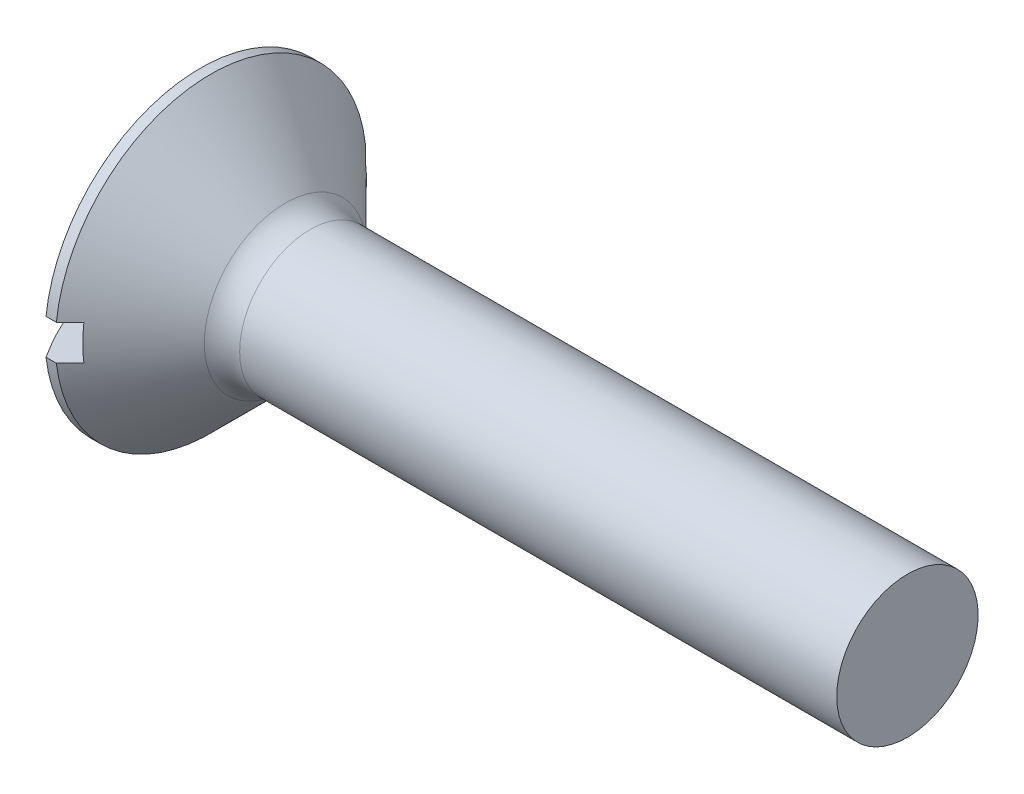
ISO-10303-21;
HEADER;
FILE_DESCRIPTION(('STEP AP214'),'2;1');
FILE_NAME('part.step','',(''),(''),'','','');
FILE_SCHEMA(('AUTOMOTIVE_DESIGN { 1 0 10303 214 1 1 1 1 }'));
ENDSEC;
DATA;
#1=APPLICATION_CONTEXT('core data for automotive mechanical design processes');
#2=APPLICATION_PROTOCOL_DEFINITION('international standard','automotive_design',2000,#1);
#3=PRODUCT_CONTEXT('',#1,'mechanical');
#4=PRODUCT('Part','Part','',(#3));
#5=PRODUCT_RELATED_PRODUCT_CATEGORY('part','',(#4));
#6=PRODUCT_DEFINITION_FORMATION('','',#4);
#7=PRODUCT_DEFINITION_CONTEXT('part definition',#1,'design');
#8=PRODUCT_DEFINITION('design','',#6,#7);
#9=PRODUCT_DEFINITION_SHAPE('','',#8);
#10=(LENGTH_UNIT() NAMED_UNIT(*) SI_UNIT(.MILLI.,.METRE.));
#11=(NAMED_UNIT(*) PLANE_ANGLE_UNIT() SI_UNIT($,.RADIAN.));
#12=(NAMED_UNIT(*) SI_UNIT($,.STERADIAN.) SOLID_ANGLE_UNIT());
#13=UNCERTAINTY_MEASURE_WITH_UNIT(LENGTH_MEASURE(1.E-05),#10,'distance_accuracy_value','');
#14=(GEOMETRIC_REPRESENTATION_CONTEXT(3) GLOBAL_UNCERTAINTY_ASSIGNED_CONTEXT((#13)) GLOBAL_UNIT_ASSIGNED_CONTEXT((#10,
#11,#12)) REPRESENTATION_CONTEXT('',''));
#15=CARTESIAN_POINT('',(0.,0.,0.));
#16=DIRECTION('',(0.,0.,1.));
#17=DIRECTION('',(1.,0.,0.));
#18=AXIS2_PLACEMENT_3D('',#15,#16,#17);
#19=CARTESIAN_POINT('',(-1.34990698556869,0.,0.));
#20=DIRECTION('',(-1.,0.,0.));
#21=DIRECTION('',(0.,0.,1.));
#22=AXIS2_PLACEMENT_3D('',#19,#20,#21);
#23=CYLINDRICAL_SURFACE('',#22,2.2);
#24=CARTESIAN_POINT('',(0.805787991708701,0.,0.));
#25=DIRECTION('',(-1.,0.,0.));
#26=DIRECTION('',(0.,0.,1.));
#27=AXIS2_PLACEMENT_3D('',#24,#25,#26);
#28=CIRCLE('',#27,2.2);
#29=CARTESIAN_POINT('',(0.805787991708701,-0.25,-2.18574929943944));
#30=VERTEX_POINT('',#29);
#31=CARTESIAN_POINT('',(0.805787991708701,-0.25,2.18574929943944));
#32=VERTEX_POINT('',#31);
#33=EDGE_CURVE('E107',#30,#32,#28,.T.);
#34=ORIENTED_EDGE('',*,*,#33,.T.);
#35=DIRECTION('',(-1.,0.,0.));
#36=VECTOR('',#35,1.);
#37=CARTESIAN_POINT('',(-1.34990698556869,-0.25,2.18574929943944));
#38=LINE('',#37,#36);
#39=CARTESIAN_POINT('',(0.659341382301987,-0.25,2.18574929943944));
#40=VERTEX_POINT('',#39);
#41=EDGE_CURVE('E112',#32,#40,#38,.T.);
#42=ORIENTED_EDGE('',*,*,#41,.T.);
#43=CARTESIAN_POINT('',(0.659341382301987,0.,0.));
#44=DIRECTION('',(-1.,0.,0.));
#45=DIRECTION('',(0.,0.,1.));
#46=AXIS2_PLACEMENT_3D('',#43,#44,#45);
#47=CIRCLE('',#46,2.2);
#48=CARTESIAN_POINT('',(0.659341382301987,-0.25,-2.18574929943944));
#49=VERTEX_POINT('',#48);
#50=EDGE_CURVE('E157',#49,#40,#47,.T.);
#51=ORIENTED_EDGE('',*,*,#50,.F.);
#52=DIRECTION('',(-1.,0.,0.));
#53=VECTOR('',#52,1.);
#54=CARTESIAN_POINT('',(-1.34990698556869,-0.25,-2.18574929943944));
#55=LINE('',#54,#53);
#56=EDGE_CURVE('E52',#49,#30,#55,.F.);
#57=ORIENTED_EDGE('',*,*,#56,.T.);
#58=EDGE_LOOP('',(#34,#42,#51,#57));
#59=FACE_BOUND('',#58,.T.);
#60=ADVANCED_FACE('F37',(#59),#23,.T.);
#61=CARTESIAN_POINT('',(4.,0.,0.));
#62=DIRECTION('',(-1.,0.,0.));
#63=DIRECTION('',(0.,1.,0.));
#64=AXIS2_PLACEMENT_3D('',#61,#62,#63);
#65=SPHERICAL_SURFACE('',#64,4.);
#66=CARTESIAN_POINT('',(0.659341382301987,0.25,2.18574929943944));
#67=VERTEX_POINT('',#66);
#68=CARTESIAN_POINT('',(0.659341382301987,0.25,-2.18574929943944));
#69=VERTEX_POINT('',#68);
#70=EDGE_CURVE('E153',#67,#69,#47,.T.);
#71=ORIENTED_EDGE('',*,*,#70,.T.);
#72=CARTESIAN_POINT('',(4.,0.25,0.));
#73=DIRECTION('',(0.,1.,0.));
#74=DIRECTION('',(0.,0.,1.));
#75=AXIS2_PLACEMENT_3D('',#72,#73,#74);
#76=CIRCLE('',#75,3.99217985566783);
#77=EDGE_CURVE('E170',#69,#67,#76,.T.);
#78=ORIENTED_EDGE('',*,*,#77,.T.);
#79=EDGE_LOOP('',(#71,#78));
#80=FACE_BOUND('',#79,.T.);
#81=ADVANCED_FACE('F135',(#80),#65,.T.);
#82=CARTESIAN_POINT('',(10.659341382302,1.,0.));
#83=DIRECTION('',(-1.,0.,0.));
#84=DIRECTION('',(0.,0.,1.));
#85=AXIS2_PLACEMENT_3D('',#82,#83,#84);
#86=PLANE('',#85);
#87=CARTESIAN_POINT('',(10.659341382302,0.,0.));
#88=DIRECTION('',(-1.,0.,0.));
#89=DIRECTION('',(0.,0.,1.));
#90=AXIS2_PLACEMENT_3D('',#87,#88,#89);
#91=CIRCLE('',#90,1.);
#92=CARTESIAN_POINT('',(10.659341382302,0.,1.));
#93=VERTEX_POINT('',#92);
#94=EDGE_CURVE('E166',#93,#93,#91,.T.);
#95=ORIENTED_EDGE('',*,*,#94,.F.);
#96=EDGE_LOOP('',(#95));
#97=FACE_BOUND('',#96,.T.);
#98=ADVANCED_FACE('F39',(#97),#86,.F.);
#99=CARTESIAN_POINT('',(-1.34990698556869,0.,0.));
#100=DIRECTION('',(-1.,0.,0.));
#101=DIRECTION('',(0.,0.,1.));
#102=AXIS2_PLACEMENT_3D('',#99,#100,#101);
#103=CYLINDRICAL_SURFACE('',#102,1.);
#104=CARTESIAN_POINT('',(2.21289477289526,0.,0.));
#105=DIRECTION('',(-1.,0.,0.));
#106=DIRECTION('',(0.,0.,1.));
#107=AXIS2_PLACEMENT_3D('',#104,#105,#106);
#108=CIRCLE('',#107,1.);
#109=CARTESIAN_POINT('',(2.21289477289526,0.,1.));
#110=VERTEX_POINT('',#109);
#111=EDGE_CURVE('E163',#110,#110,#108,.T.);
#112=ORIENTED_EDGE('',*,*,#111,.F.);
#113=EDGE_LOOP('',(#112));
#114=FACE_BOUND('',#113,.T.);
#115=ORIENTED_EDGE('',*,*,#94,.T.);
#116=EDGE_LOOP('',(#115));
#117=FACE_BOUND('',#116,.T.);
#118=ADVANCED_FACE('F224',(#114,#117),#103,.T.);
#119=CARTESIAN_POINT('',(2.21289477289526,0.,0.));
#120=DIRECTION('',(-1.,0.,0.));
#121=DIRECTION('',(0.,0.,1.));
#122=AXIS2_PLACEMENT_3D('',#119,#120,#121);
#123=TOROIDAL_SURFACE('',#122,1.5,0.5);
#124=CARTESIAN_POINT('',(1.85934138230199,0.,0.));
#125=DIRECTION('',(-1.,0.,0.));
#126=DIRECTION('',(0.,0.,1.));
#127=AXIS2_PLACEMENT_3D('',#124,#125,#126);
#128=CIRCLE('',#127,1.14644660940672);
#129=CARTESIAN_POINT('',(1.85934138230199,0.,1.14644660940672));
#130=VERTEX_POINT('',#129);
#131=EDGE_CURVE('E155',#130,#130,#128,.T.);
#132=ORIENTED_EDGE('',*,*,#131,.F.);
#133=EDGE_LOOP('',(#132));
#134=FACE_BOUND('',#133,.T.);
#135=ORIENTED_EDGE('',*,*,#111,.T.);
#136=EDGE_LOOP('',(#135));
#137=FACE_BOUND('',#136,.T.);
#138=ADVANCED_FACE('F141',(#134,#137),#123,.F.);
#139=CARTESIAN_POINT('',(1.85934138230199,0.,0.));
#140=DIRECTION('',(-1.,0.,0.));
#141=DIRECTION('',(0.,0.,1.));
#142=AXIS2_PLACEMENT_3D('',#139,#140,#141);
#143=CONICAL_SURFACE('',#142,1.14644660940672,0.785398163397443);
#144=CARTESIAN_POINT('',(1.,0.,0.));
#145=DIRECTION('',(1.,0.,0.));
#146=DIRECTION('',(0.,0.,-1.));
#147=AXIS2_PLACEMENT_3D('',#144,#145,#146);
#148=CIRCLE('',#147,2.0057879917087);
#149=CARTESIAN_POINT('',(1.,-0.25,-1.99014709699631));
#150=VERTEX_POINT('',#149);
#151=CARTESIAN_POINT('',(1.,0.25,-1.99014709699631));
#152=VERTEX_POINT('',#151);
#153=EDGE_CURVE('E11',#150,#152,#148,.T.);
#154=ORIENTED_EDGE('',*,*,#153,.T.);
#155=CARTESIAN_POINT('',(-1.83698245948068,0.25,4.83631322837063));
#156=CARTESIAN_POINT('',(-1.67200251748976,0.25,4.67111124858432));
#157=CARTESIAN_POINT('',(-1.50703219750879,0.25,4.50589965403619));
#158=CARTESIAN_POINT('',(-1.17712189701564,0.25,4.17544365149756));
#159=CARTESIAN_POINT('',(-1.01218191674531,0.25,4.01019924326562));
#160=CARTESIAN_POINT('',(-0.682317079626345,0.25,3.67963765967747));
#161=CARTESIAN_POINT('',(-0.517392230465198,0.25,3.51432047664977));
#162=CARTESIAN_POINT('',(-0.187610029747062,0.25,3.18362124471735));
#163=CARTESIAN_POINT('',(-0.0227526776956365,0.25,3.0182391963058));
#164=CARTESIAN_POINT('',(0.310957822555568,0.25,2.68324954374364));
#165=CARTESIAN_POINT('',(0.479808267998293,0.25,2.51363924738426));
#166=CARTESIAN_POINT('',(0.817318165064023,0.25,2.17422109230254));
#167=CARTESIAN_POINT('',(0.985977612399083,0.25,2.00441322931174));
#168=CARTESIAN_POINT('',(1.23864723005972,0.25,1.74940368052243));
#169=CARTESIAN_POINT('',(1.32281246189407,0.25,1.66435565390886));
#170=CARTESIAN_POINT('',(1.49097971054593,0.25,1.49409670473752));
#171=CARTESIAN_POINT('',(1.574981725932,0.25,1.40888578076399));
#172=CARTESIAN_POINT('',(1.74270521030829,0.25,1.23819529064809));
#173=CARTESIAN_POINT('',(1.82642669067598,0.25,1.15271573567967));
#174=CARTESIAN_POINT('',(1.99336991992402,0.25,0.981270398184751));
#175=CARTESIAN_POINT('',(2.07659167828557,0.25,0.895304624943732));
#176=CARTESIAN_POINT('',(2.18157923543974,0.25,0.785407488852699));
#177=CARTESIAN_POINT('',(2.20387594501931,0.25,0.761984264736825));
#178=CARTESIAN_POINT('',(2.24835297867986,0.25,0.715027330641845));
#179=CARTESIAN_POINT('',(2.27053330122487,0.25,0.691493619212345));
#180=CARTESIAN_POINT('',(2.33674522419903,0.25,0.620804999273036));
#181=CARTESIAN_POINT('',(2.38056068789035,0.25,0.573445008800913));
#182=CARTESIAN_POINT('',(2.45273508441549,0.25,0.493510859429766));
#183=CARTESIAN_POINT('',(2.48141411295268,0.25,0.461225956584607));
#184=CARTESIAN_POINT('',(2.53801077597681,0.25,0.395724382069651));
#185=CARTESIAN_POINT('',(2.56592437474304,0.25,0.362504153200525));
#186=CARTESIAN_POINT('',(2.60656438876708,0.25,0.311422651604376));
#187=CARTESIAN_POINT('',(2.61996632046315,0.25,0.294102157274269));
#188=CARTESIAN_POINT('',(2.6460562160832,0.25,0.258934859656766));
#189=CARTESIAN_POINT('',(2.65874444926368,0.25,0.241088258778923));
#190=CARTESIAN_POINT('',(2.68293598049307,0.25,0.204736875664094));
#191=CARTESIAN_POINT('',(2.69444527453682,0.25,0.186236141515002));
#192=CARTESIAN_POINT('',(2.71558726577708,0.25,0.148210433053987));
#193=CARTESIAN_POINT('',(2.7252251406011,0.25,0.128688479994859));
#194=CARTESIAN_POINT('',(2.7393019583475,0.25,0.0933128960668353));
#195=CARTESIAN_POINT('',(2.74443725670789,0.25,0.0777471951612877));
#196=CARTESIAN_POINT('',(2.75204947134678,0.25,0.046014532858441));
#197=CARTESIAN_POINT('',(2.75453865938164,0.25,0.029850709984747));
#198=CARTESIAN_POINT('',(2.75630624384426,0.25,-0.00280238691021115));
#199=CARTESIAN_POINT('',(2.75555754608878,0.25,-0.0192932533342108));
#200=CARTESIAN_POINT('',(2.75098042671744,0.25,-0.0518644022865893));
#201=CARTESIAN_POINT('',(2.74714133417458,0.25,-0.0679430626680099));
#202=CARTESIAN_POINT('',(2.73445798437951,0.25,-0.107972205138843));
#203=CARTESIAN_POINT('',(2.72402277208825,0.25,-0.131395389372218));
#204=CARTESIAN_POINT('',(2.70620549483301,0.25,-0.165353168235739));
#205=CARTESIAN_POINT('',(2.69988385651598,0.25,-0.176507300247304));
#206=CARTESIAN_POINT('',(2.68669482802784,0.25,-0.198488199382887));
#207=CARTESIAN_POINT('',(2.67982767628442,0.25,-0.209315106701697));
#208=CARTESIAN_POINT('',(2.65584214388967,0.25,-0.245635326298212));
#209=CARTESIAN_POINT('',(2.63779409007131,0.25,-0.270506382016466));
#210=CARTESIAN_POINT('',(2.60051835427222,0.25,-0.319355035634598));
#211=CARTESIAN_POINT('',(2.58128966891391,0.25,-0.343331844935442));
#212=CARTESIAN_POINT('',(2.54209197784562,0.25,-0.390758871578168));
#213=CARTESIAN_POINT('',(2.52212144369132,0.25,-0.414207821299323));
#214=CARTESIAN_POINT('',(2.4817349279707,0.25,-0.460720070548103));
#215=CARTESIAN_POINT('',(2.4613189026726,0.25,-0.483783331818401));
#216=CARTESIAN_POINT('',(2.39956443872557,0.25,-0.552654809945157));
#217=CARTESIAN_POINT('',(2.35778563744697,0.25,-0.598067191865122));
#218=CARTESIAN_POINT('',(2.27369736974625,0.25,-0.688267389393211));
#219=CARTESIAN_POINT('',(2.2313887779456,0.25,-0.733056028182925));
#220=CARTESIAN_POINT('',(2.10469544450037,0.25,-0.866154077145054));
#221=CARTESIAN_POINT('',(2.0198116428532,0.25,-0.95398788236113));
#222=CARTESIAN_POINT('',(1.84949069293147,0.25,-1.12911950364055));
#223=CARTESIAN_POINT('',(1.76405352448915,0.25,-1.21641729994028));
#224=CARTESIAN_POINT('',(1.59282418765089,0.25,-1.39076948189754));
#225=CARTESIAN_POINT('',(1.50703183385865,0.25,-1.47782368570018));
#226=CARTESIAN_POINT('',(1.33527318450732,0.25,-1.651757508343));
#227=CARTESIAN_POINT('',(1.24930689150799,0.25,-1.73863712971545));
#228=CARTESIAN_POINT('',(0.9917386319949,0.25,-1.99861440720129));
#229=CARTESIAN_POINT('',(0.819973992956283,0.25,-2.17155089213982));
#230=CARTESIAN_POINT('',(0.476274930135871,0.25,-2.51719193459411));
#231=CARTESIAN_POINT('',(0.304340543144986,0.25,-2.68989652873796));
#232=CARTESIAN_POINT('',(-0.0314189260324304,0.25,-3.02693427074177));
#233=CARTESIAN_POINT('',(-0.195238610301845,0.25,-3.19127279532241));
#234=CARTESIAN_POINT('',(-0.522952955185012,0.25,-3.51989485734883));
#235=CARTESIAN_POINT('',(-0.686847619730625,0.25,-3.6841783908726));
#236=CARTESIAN_POINT('',(-1.01510328717888,0.25,-4.01312614334428));
#237=CARTESIAN_POINT('',(-1.1794644020159,0.25,-4.17779025059113));
#238=CARTESIAN_POINT('',(-1.50820797637729,0.25,-4.50707716699987));
#239=CARTESIAN_POINT('',(-1.67259043399619,0.25,-4.67169997806405));
#240=CARTESIAN_POINT('',(-1.83698245948068,0.25,-4.83631322837063));
#241=B_SPLINE_CURVE_WITH_KNOTS('',3,(#155,#156,#157,#158,#159,#160,#161,#162,#163,#164,#165,
#166,#167,#168,#169,#170,#171,#172,#173,#174,#175,#176,#177,#178,#179,#180,#181,#182,#183,#184,
#185,#186,#187,#188,#189,#190,#191,#192,#193,#194,#195,#196,#197,#198,#199,#200,#201,#202,#203,
#204,#205,#206,#207,#208,#209,#210,#211,#212,#213,#214,#215,#216,#217,#218,#219,#220,#221,#222,
#223,#224,#225,#226,#227,#228,#229,#230,#231,#232,#233,#234,#235,#236,#237,#238,#239,#240),
.UNSPECIFIED.,.F.,.F.,(4,2,2,2,2,2,2,2,2,2,2,2,2,2,2,2,2,2,2,2,2,2,2,2,2,2,2,2,2,2,2,2,2,2,2,2,
2,2,2,2,2,2,4),(0.,0.70042179219447,1.40084894485202,2.1013985723305,2.80194297280929,
3.51992841403787,4.23792966671083,4.59688999898567,4.95585346531917,5.31480219279213,
5.67374408828576,5.77075967234676,5.86777653353605,6.06132118589767,6.19086619197356,
6.32099779414288,6.38668698094811,6.45235121669122,6.5176629117242,6.5827912514269,
6.63180034803804,6.68058115214815,6.72977093358632,6.779131296375,6.85560463824621,
6.894068122404,6.93251488684774,7.02462569378357,7.11681589611361,7.20920790582525,
7.30160902639491,7.48671665815731,7.67155097442674,8.03798504750817,8.4044325515011,
8.77110452086075,9.13777113279978,9.86899633732165,10.6000878279833,11.2962173393315,
11.9923889086342,12.6903570961859,13.3882828448399),.UNSPECIFIED.);
#242=CARTESIAN_POINT('',(0.805787991708701,0.25,-2.18574929943944));
#243=VERTEX_POINT('',#242);
#244=EDGE_CURVE('E176',#152,#243,#241,.T.);
#245=ORIENTED_EDGE('',*,*,#244,.T.);
#246=CARTESIAN_POINT('',(0.805787991708701,0.25,2.18574929943944));
#247=VERTEX_POINT('',#246);
#248=EDGE_CURVE('E152',#247,#243,#28,.T.);
#249=ORIENTED_EDGE('',*,*,#248,.F.);
#250=CARTESIAN_POINT('',(1.,0.25,1.99014709699631));
#251=VERTEX_POINT('',#250);
#252=EDGE_CURVE('E175',#247,#251,#241,.T.);
#253=ORIENTED_EDGE('',*,*,#252,.T.);
#254=CARTESIAN_POINT('',(1.,-0.25,1.99014709699631));
#255=VERTEX_POINT('',#254);
#256=EDGE_CURVE('E41',#251,#255,#148,.T.);
#257=ORIENTED_EDGE('',*,*,#256,.T.);
#258=CARTESIAN_POINT('',(-1.83698245948068,-0.25,-4.83631322837063));
#259=CARTESIAN_POINT('',(-1.67200251748976,-0.25,-4.67111124858432));
#260=CARTESIAN_POINT('',(-1.50703219750879,-0.25,-4.50589965403619));
#261=CARTESIAN_POINT('',(-1.17712189701563,-0.25,-4.17544365149756));
#262=CARTESIAN_POINT('',(-1.01218191674531,-0.25,-4.01019924326561));
#263=CARTESIAN_POINT('',(-0.682317079626343,-0.25,-3.67963765967747));
#264=CARTESIAN_POINT('',(-0.517392230465196,-0.25,-3.51432047664977));
#265=CARTESIAN_POINT('',(-0.187610029747059,-0.25,-3.18362124471734));
#266=CARTESIAN_POINT('',(-0.0227526776956331,-0.25,-3.0182391963058));
#267=CARTESIAN_POINT('',(0.310957822555571,-0.25,-2.68324954374364));
#268=CARTESIAN_POINT('',(0.479808267998296,-0.25,-2.51363924738426));
#269=CARTESIAN_POINT('',(0.817318165064025,-0.25,-2.17422109230254));
#270=CARTESIAN_POINT('',(0.985977612399085,-0.25,-2.00441322931174));
#271=CARTESIAN_POINT('',(1.23864723005972,-0.25,-1.74940368052243));
#272=CARTESIAN_POINT('',(1.32281246189407,-0.25,-1.66435565390886));
#273=CARTESIAN_POINT('',(1.49097971054593,-0.25,-1.49409670473752));
#274=CARTESIAN_POINT('',(1.574981725932,-0.25,-1.40888578076399));
#275=CARTESIAN_POINT('',(1.74270521030829,-0.25,-1.23819529064808));
#276=CARTESIAN_POINT('',(1.82642669067598,-0.25,-1.15271573567967));
#277=CARTESIAN_POINT('',(1.99336991992402,-0.25,-0.981270398184751));
#278=CARTESIAN_POINT('',(2.07659167828557,-0.25,-0.895304624943732));
#279=CARTESIAN_POINT('',(2.18157923543974,-0.25,-0.785407488852699));
#280=CARTESIAN_POINT('',(2.20387594501931,-0.25,-0.761984264736825));
#281=CARTESIAN_POINT('',(2.24835297867986,-0.25,-0.715027330641845));
#282=CARTESIAN_POINT('',(2.27053330122487,-0.25,-0.691493619212345));
#283=CARTESIAN_POINT('',(2.33674522419903,-0.25,-0.620804999273036));
#284=CARTESIAN_POINT('',(2.38056068789035,-0.25,-0.573445008800913));
#285=CARTESIAN_POINT('',(2.45273508441549,-0.25,-0.493510859429766));
#286=CARTESIAN_POINT('',(2.48141411295268,-0.25,-0.461225956584607));
#287=CARTESIAN_POINT('',(2.53801077597681,-0.25,-0.395724382069651));
#288=CARTESIAN_POINT('',(2.56592437474304,-0.25,-0.362504153200525));
#289=CARTESIAN_POINT('',(2.60656438876708,-0.25,-0.311422651604376));
#290=CARTESIAN_POINT('',(2.61996632046315,-0.25,-0.294102157274269));
#291=CARTESIAN_POINT('',(2.6460562160832,-0.25,-0.258934859656766));
#292=CARTESIAN_POINT('',(2.65874444926368,-0.25,-0.241088258778922));
#293=CARTESIAN_POINT('',(2.68293598049307,-0.25,-0.204736875664094));
#294=CARTESIAN_POINT('',(2.69444527453682,-0.25,-0.186236141515002));
#295=CARTESIAN_POINT('',(2.71558726577708,-0.25,-0.148210433053987));
#296=CARTESIAN_POINT('',(2.7252251406011,-0.25,-0.128688479994859));
#297=CARTESIAN_POINT('',(2.7393019583475,-0.25,-0.0933128960668353));
#298=CARTESIAN_POINT('',(2.74443725670789,-0.25,-0.0777471951612877));
#299=CARTESIAN_POINT('',(2.75204947134678,-0.25,-0.046014532858441));
#300=CARTESIAN_POINT('',(2.75453865938164,-0.25,-0.029850709984747));
#301=CARTESIAN_POINT('',(2.75630624384426,-0.25,0.00280238691021115));
#302=CARTESIAN_POINT('',(2.75555754608878,-0.25,0.0192932533342108));
#303=CARTESIAN_POINT('',(2.75098042671744,-0.25,0.0518644022865893));
#304=CARTESIAN_POINT('',(2.74714133417458,-0.25,0.0679430626680099));
#305=CARTESIAN_POINT('',(2.73445798437951,-0.25,0.107972205138843));
#306=CARTESIAN_POINT('',(2.72402277208825,-0.25,0.131395389372218));
#307=CARTESIAN_POINT('',(2.70620549483301,-0.25,0.165353168235739));
#308=CARTESIAN_POINT('',(2.69988385651598,-0.25,0.176507300247304));
#309=CARTESIAN_POINT('',(2.68669482802784,-0.25,0.198488199382887));
#310=CARTESIAN_POINT('',(2.67982767628442,-0.25,0.209315106701697));
#311=CARTESIAN_POINT('',(2.65584214388967,-0.25,0.245635326298212));
#312=CARTESIAN_POINT('',(2.63779409007131,-0.25,0.270506382016466));
#313=CARTESIAN_POINT('',(2.60051835427222,-0.25,0.319355035634598));
#314=CARTESIAN_POINT('',(2.58128966891391,-0.25,0.343331844935442));
#315=CARTESIAN_POINT('',(2.54209197784562,-0.25,0.390758871578169));
#316=CARTESIAN_POINT('',(2.52212144369132,-0.25,0.414207821299323));
#317=CARTESIAN_POINT('',(2.4817349279707,-0.25,0.460720070548103));
#318=CARTESIAN_POINT('',(2.4613189026726,-0.25,0.483783331818401));
#319=CARTESIAN_POINT('',(2.39956443872557,-0.25,0.552654809945157));
#320=CARTESIAN_POINT('',(2.35778563744697,-0.25,0.598067191865123));
#321=CARTESIAN_POINT('',(2.27369736974625,-0.25,0.688267389393212));
#322=CARTESIAN_POINT('',(2.2313887779456,-0.25,0.733056028182925));
#323=CARTESIAN_POINT('',(2.10469544450037,-0.25,0.866154077145054));
#324=CARTESIAN_POINT('',(2.0198116428532,-0.25,0.95398788236113));
#325=CARTESIAN_POINT('',(1.84949069293147,-0.25,1.12911950364055));
#326=CARTESIAN_POINT('',(1.76405352448915,-0.25,1.21641729994028));
#327=CARTESIAN_POINT('',(1.59282418765089,-0.25,1.39076948189754));
#328=CARTESIAN_POINT('',(1.50703183385865,-0.25,1.47782368570018));
#329=CARTESIAN_POINT('',(1.33527318450732,-0.25,1.651757508343));
#330=CARTESIAN_POINT('',(1.24930689150799,-0.25,1.73863712971545));
#331=CARTESIAN_POINT('',(0.9917386319949,-0.25,1.99861440720129));
#332=CARTESIAN_POINT('',(0.819973992956283,-0.25,2.17155089213982));
#333=CARTESIAN_POINT('',(0.476274930135871,-0.25,2.51719193459411));
#334=CARTESIAN_POINT('',(0.304340543144986,-0.25,2.68989652873796));
#335=CARTESIAN_POINT('',(-0.0314189260324304,-0.25,3.02693427074177));
#336=CARTESIAN_POINT('',(-0.195238610301845,-0.25,3.19127279532241));
#337=CARTESIAN_POINT('',(-0.522952955185012,-0.25,3.51989485734883));
#338=CARTESIAN_POINT('',(-0.686847619730624,-0.25,3.6841783908726));
#339=CARTESIAN_POINT('',(-1.01510328717888,-0.25,4.01312614334428));
#340=CARTESIAN_POINT('',(-1.1794644020159,-0.25,4.17779025059113));
#341=CARTESIAN_POINT('',(-1.50820797637729,-0.25,4.50707716699987));
#342=CARTESIAN_POINT('',(-1.67259043399619,-0.25,4.67169997806405));
#343=CARTESIAN_POINT('',(-1.83698245948068,-0.25,4.83631322837063));
#344=B_SPLINE_CURVE_WITH_KNOTS('',3,(#258,#259,#260,#261,#262,#263,#264,#265,#266,#267,#268,
#269,#270,#271,#272,#273,#274,#275,#276,#277,#278,#279,#280,#281,#282,#283,#284,#285,#286,#287,
#288,#289,#290,#291,#292,#293,#294,#295,#296,#297,#298,#299,#300,#301,#302,#303,#304,#305,#306,
#307,#308,#309,#310,#311,#312,#313,#314,#315,#316,#317,#318,#319,#320,#321,#322,#323,#324,#325,
#326,#327,#328,#329,#330,#331,#332,#333,#334,#335,#336,#337,#338,#339,#340,#341,#342,#343),
.UNSPECIFIED.,.F.,.F.,(4,2,2,2,2,2,2,2,2,2,2,2,2,2,2,2,2,2,2,2,2,2,2,2,2,2,2,2,2,2,2,2,2,2,2,2,
2,2,2,2,2,2,4),(0.,0.700421792194471,1.40084894485202,2.10139857233051,2.80194297280929,
3.51992841403788,4.23792966671083,4.59688999898567,4.95585346531917,5.31480219279213,
5.67374408828576,5.77075967234676,5.86777653353605,6.06132118589767,6.19086619197356,
6.32099779414288,6.38668698094811,6.45235121669122,6.5176629117242,6.5827912514269,
6.63180034803804,6.68058115214815,6.72977093358632,6.779131296375,6.85560463824621,
6.894068122404,6.93251488684774,7.02462569378357,7.11681589611361,7.20920790582525,
7.30160902639491,7.48671665815731,7.67155097442674,8.03798504750817,8.4044325515011,
8.77110452086075,9.13777113279978,9.86899633732165,10.6000878279833,11.2962173393315,
11.9923889086342,12.6903570961858,13.3882828448399),.UNSPECIFIED.);
#345=EDGE_CURVE('E101',#255,#32,#344,.T.);
#346=ORIENTED_EDGE('',*,*,#345,.T.);
#347=ORIENTED_EDGE('',*,*,#33,.F.);
#348=EDGE_CURVE('E99',#30,#150,#344,.T.);
#349=ORIENTED_EDGE('',*,*,#348,.T.);
#350=EDGE_LOOP('',(#154,#245,#249,#253,#257,#346,#347,#349));
#351=FACE_BOUND('',#350,.T.);
#352=ORIENTED_EDGE('',*,*,#131,.T.);
#353=EDGE_LOOP('',(#352));
#354=FACE_BOUND('',#353,.T.);
#355=ADVANCED_FACE('F104',(#351,#354),#143,.T.);
#356=ORIENTED_EDGE('',*,*,#248,.T.);
#357=DIRECTION('',(-1.,0.,0.));
#358=VECTOR('',#357,1.);
#359=CARTESIAN_POINT('',(-1.34990698556869,0.25,-2.18574929943944));
#360=LINE('',#359,#358);
#361=EDGE_CURVE('E60',#243,#69,#360,.T.);
#362=ORIENTED_EDGE('',*,*,#361,.T.);
#363=ORIENTED_EDGE('',*,*,#70,.F.);
#364=DIRECTION('',(-1.,0.,0.));
#365=VECTOR('',#364,1.);
#366=CARTESIAN_POINT('',(-1.34990698556869,0.25,2.18574929943944));
#367=LINE('',#366,#365);
#368=EDGE_CURVE('E108',#67,#247,#367,.F.);
#369=ORIENTED_EDGE('',*,*,#368,.T.);
#370=EDGE_LOOP('',(#356,#362,#363,#369));
#371=FACE_BOUND('',#370,.T.);
#372=ADVANCED_FACE('F133',(#371),#23,.T.);
#373=ORIENTED_EDGE('',*,*,#50,.T.);
#374=CARTESIAN_POINT('',(4.,-0.25,0.));
#375=DIRECTION('',(0.,-1.,0.));
#376=DIRECTION('',(0.,0.,-1.));
#377=AXIS2_PLACEMENT_3D('',#374,#375,#376);
#378=CIRCLE('',#377,3.99217985566783);
#379=EDGE_CURVE('E169',#40,#49,#378,.T.);
#380=ORIENTED_EDGE('',*,*,#379,.T.);
#381=EDGE_LOOP('',(#373,#380));
#382=FACE_BOUND('',#381,.T.);
#383=ADVANCED_FACE('F131',(#382),#65,.T.);
#384=CARTESIAN_POINT('',(1.,-0.25,-2.2));
#385=DIRECTION('',(1.,0.,0.));
#386=DIRECTION('',(0.,0.,-1.));
#387=AXIS2_PLACEMENT_3D('',#384,#385,#386);
#388=PLANE('',#387);
#389=DIRECTION('',(0.,0.,1.));
#390=VECTOR('',#389,1.);
#391=CARTESIAN_POINT('',(1.,0.25,-2.2));
#392=LINE('',#391,#390);
#393=EDGE_CURVE('E95',#152,#251,#392,.T.);
#394=ORIENTED_EDGE('',*,*,#393,.F.);
#395=ORIENTED_EDGE('',*,*,#153,.F.);
#396=DIRECTION('',(0.,0.,1.));
#397=VECTOR('',#396,1.);
#398=CARTESIAN_POINT('',(1.,-0.25,-2.2));
#399=LINE('',#398,#397);
#400=EDGE_CURVE('E92',#150,#255,#399,.T.);
#401=ORIENTED_EDGE('',*,*,#400,.T.);
#402=ORIENTED_EDGE('',*,*,#256,.F.);
#403=EDGE_LOOP('',(#394,#395,#401,#402));
#404=FACE_BOUND('',#403,.T.);
#405=ADVANCED_FACE('F91',(#404),#388,.F.);
#406=CARTESIAN_POINT('',(0.,0.25,-2.2));
#407=DIRECTION('',(0.,1.,0.));
#408=DIRECTION('',(0.,0.,1.));
#409=AXIS2_PLACEMENT_3D('',#406,#407,#408);
#410=PLANE('',#409);
#411=ORIENTED_EDGE('',*,*,#368,.F.);
#412=ORIENTED_EDGE('',*,*,#77,.F.);
#413=ORIENTED_EDGE('',*,*,#361,.F.);
#414=ORIENTED_EDGE('',*,*,#244,.F.);
#415=ORIENTED_EDGE('',*,*,#393,.T.);
#416=ORIENTED_EDGE('',*,*,#252,.F.);
#417=EDGE_LOOP('',(#411,#412,#413,#414,#415,#416));
#418=FACE_BOUND('',#417,.T.);
#419=ADVANCED_FACE('F129',(#418),#410,.F.);
#420=CARTESIAN_POINT('',(0.,-0.25,-2.2));
#421=DIRECTION('',(0.,-1.,0.));
#422=DIRECTION('',(0.,0.,-1.));
#423=AXIS2_PLACEMENT_3D('',#420,#421,#422);
#424=PLANE('',#423);
#425=ORIENTED_EDGE('',*,*,#56,.F.);
#426=ORIENTED_EDGE('',*,*,#379,.F.);
#427=ORIENTED_EDGE('',*,*,#41,.F.);
#428=ORIENTED_EDGE('',*,*,#345,.F.);
#429=ORIENTED_EDGE('',*,*,#400,.F.);
#430=ORIENTED_EDGE('',*,*,#348,.F.);
#431=EDGE_LOOP('',(#425,#426,#427,#428,#429,#430));
#432=FACE_BOUND('',#431,.T.);
#433=ADVANCED_FACE('F98',(#432),#424,.F.);
#434=CLOSED_SHELL('',(#60,#81,#98,#118,#138,#355,#372,#383,#405,#419,#433));
#435=MANIFOLD_SOLID_BREP('B2',#434);
#436=ADVANCED_BREP_SHAPE_REPRESENTATION('',(#18,#435),#14);
#437=SHAPE_DEFINITION_REPRESENTATION(#9,#436);
ENDSEC;
END-ISO-10303-21;
